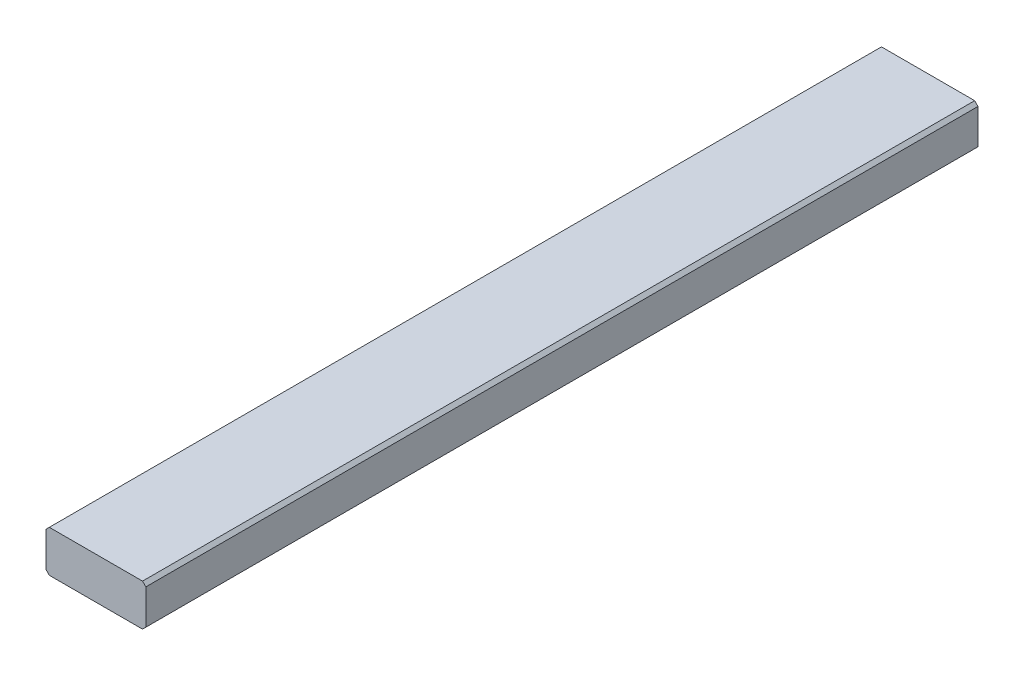
ISO-10303-21;
HEADER;
FILE_DESCRIPTION(('STEP AP214'),'2;1');
FILE_NAME('part.step','',(''),(''),'','','');
FILE_SCHEMA(('AUTOMOTIVE_DESIGN { 1 0 10303 214 1 1 1 1 }'));
ENDSEC;
DATA;
#1=APPLICATION_CONTEXT('core data for automotive mechanical design processes');
#2=APPLICATION_PROTOCOL_DEFINITION('international standard','automotive_design',2000,#1);
#3=PRODUCT_CONTEXT('',#1,'mechanical');
#4=PRODUCT('Part','Part','',(#3));
#5=PRODUCT_RELATED_PRODUCT_CATEGORY('part','',(#4));
#6=PRODUCT_DEFINITION_FORMATION('','',#4);
#7=PRODUCT_DEFINITION_CONTEXT('part definition',#1,'design');
#8=PRODUCT_DEFINITION('design','',#6,#7);
#9=PRODUCT_DEFINITION_SHAPE('','',#8);
#10=(LENGTH_UNIT() NAMED_UNIT(*) SI_UNIT(.MILLI.,.METRE.));
#11=(NAMED_UNIT(*) PLANE_ANGLE_UNIT() SI_UNIT($,.RADIAN.));
#12=(NAMED_UNIT(*) SI_UNIT($,.STERADIAN.) SOLID_ANGLE_UNIT());
#13=UNCERTAINTY_MEASURE_WITH_UNIT(LENGTH_MEASURE(1.E-05),#10,'distance_accuracy_value','');
#14=(GEOMETRIC_REPRESENTATION_CONTEXT(3) GLOBAL_UNCERTAINTY_ASSIGNED_CONTEXT((#13)) GLOBAL_UNIT_ASSIGNED_CONTEXT((#10,
#11,#12)) REPRESENTATION_CONTEXT('',''));
#15=CARTESIAN_POINT('',(0.,0.,0.));
#16=DIRECTION('',(0.,0.,1.));
#17=DIRECTION('',(1.,0.,0.));
#18=AXIS2_PLACEMENT_3D('',#15,#16,#17);
#19=CARTESIAN_POINT('',(-28.,12.5,500.));
#20=DIRECTION('',(0.,-1.,0.));
#21=DIRECTION('',(0.,0.,-1.));
#22=AXIS2_PLACEMENT_3D('',#19,#20,#21);
#23=PLANE('',#22);
#24=DIRECTION('',(-1.,0.,0.));
#25=VECTOR('',#24,1.);
#26=CARTESIAN_POINT('',(-28.,12.5,0.));
#27=LINE('',#26,#25);
#28=CARTESIAN_POINT('',(28.,12.5,0.));
#29=VERTEX_POINT('',#28);
#30=CARTESIAN_POINT('',(-28.,12.5,0.));
#31=VERTEX_POINT('',#30);
#32=EDGE_CURVE('E131',#29,#31,#27,.T.);
#33=ORIENTED_EDGE('',*,*,#32,.T.);
#34=DIRECTION('',(0.,0.,-1.));
#35=VECTOR('',#34,1.);
#36=CARTESIAN_POINT('',(-28.,12.5,500.));
#37=LINE('',#36,#35);
#38=CARTESIAN_POINT('',(-28.,12.5,500.));
#39=VERTEX_POINT('',#38);
#40=EDGE_CURVE('E11',#39,#31,#37,.T.);
#41=ORIENTED_EDGE('',*,*,#40,.F.);
#42=DIRECTION('',(-1.,0.,0.));
#43=VECTOR('',#42,1.);
#44=CARTESIAN_POINT('',(-28.,12.5,500.));
#45=LINE('',#44,#43);
#46=CARTESIAN_POINT('',(28.,12.5,500.));
#47=VERTEX_POINT('',#46);
#48=EDGE_CURVE('E145',#47,#39,#45,.T.);
#49=ORIENTED_EDGE('',*,*,#48,.F.);
#50=DIRECTION('',(0.,0.,-1.));
#51=VECTOR('',#50,1.);
#52=CARTESIAN_POINT('',(28.,12.5,500.));
#53=LINE('',#52,#51);
#54=EDGE_CURVE('E127',#47,#29,#53,.T.);
#55=ORIENTED_EDGE('',*,*,#54,.T.);
#56=EDGE_LOOP('',(#33,#41,#49,#55));
#57=FACE_BOUND('',#56,.T.);
#58=ADVANCED_FACE('F35',(#57),#23,.F.);
#59=CARTESIAN_POINT('',(-30.,10.5,500.));
#60=DIRECTION('',(0.707106781186547,-0.707106781186548,0.));
#61=DIRECTION('',(0.707106781186548,0.707106781186547,0.));
#62=AXIS2_PLACEMENT_3D('',#59,#60,#61);
#63=PLANE('',#62);
#64=DIRECTION('',(-0.707106781186548,-0.707106781186547,0.));
#65=VECTOR('',#64,1.);
#66=CARTESIAN_POINT('',(-30.,10.5,0.));
#67=LINE('',#66,#65);
#68=CARTESIAN_POINT('',(-30.,10.5,0.));
#69=VERTEX_POINT('',#68);
#70=EDGE_CURVE('E134',#31,#69,#67,.T.);
#71=ORIENTED_EDGE('',*,*,#70,.T.);
#72=DIRECTION('',(0.,0.,-1.));
#73=VECTOR('',#72,1.);
#74=CARTESIAN_POINT('',(-30.,10.5,500.));
#75=LINE('',#74,#73);
#76=CARTESIAN_POINT('',(-30.,10.5,500.));
#77=VERTEX_POINT('',#76);
#78=EDGE_CURVE('E43',#77,#69,#75,.T.);
#79=ORIENTED_EDGE('',*,*,#78,.F.);
#80=DIRECTION('',(-0.707106781186548,-0.707106781186547,0.));
#81=VECTOR('',#80,1.);
#82=CARTESIAN_POINT('',(-30.,10.5,500.));
#83=LINE('',#82,#81);
#84=EDGE_CURVE('E94',#39,#77,#83,.T.);
#85=ORIENTED_EDGE('',*,*,#84,.F.);
#86=ORIENTED_EDGE('',*,*,#40,.T.);
#87=EDGE_LOOP('',(#71,#79,#85,#86));
#88=FACE_BOUND('',#87,.T.);
#89=ADVANCED_FACE('F180',(#88),#63,.F.);
#90=CARTESIAN_POINT('',(-30.,10.5,500.));
#91=DIRECTION('',(1.,0.,0.));
#92=DIRECTION('',(0.,0.,-1.));
#93=AXIS2_PLACEMENT_3D('',#90,#91,#92);
#94=PLANE('',#93);
#95=DIRECTION('',(0.,-1.,0.));
#96=VECTOR('',#95,1.);
#97=CARTESIAN_POINT('',(-30.,10.5,0.));
#98=LINE('',#97,#96);
#99=CARTESIAN_POINT('',(-30.,-10.5,0.));
#100=VERTEX_POINT('',#99);
#101=EDGE_CURVE('E136',#69,#100,#98,.T.);
#102=ORIENTED_EDGE('',*,*,#101,.T.);
#103=DIRECTION('',(0.,0.,-1.));
#104=VECTOR('',#103,1.);
#105=CARTESIAN_POINT('',(-30.,-10.5,500.));
#106=LINE('',#105,#104);
#107=CARTESIAN_POINT('',(-30.,-10.5,500.));
#108=VERTEX_POINT('',#107);
#109=EDGE_CURVE('E152',#108,#100,#106,.T.);
#110=ORIENTED_EDGE('',*,*,#109,.F.);
#111=DIRECTION('',(0.,-1.,0.));
#112=VECTOR('',#111,1.);
#113=CARTESIAN_POINT('',(-30.,10.5,500.));
#114=LINE('',#113,#112);
#115=EDGE_CURVE('E160',#77,#108,#114,.T.);
#116=ORIENTED_EDGE('',*,*,#115,.F.);
#117=ORIENTED_EDGE('',*,*,#78,.T.);
#118=EDGE_LOOP('',(#102,#110,#116,#117));
#119=FACE_BOUND('',#118,.T.);
#120=ADVANCED_FACE('F158',(#119),#94,.F.);
#121=CARTESIAN_POINT('',(-30.,-10.5,500.));
#122=DIRECTION('',(0.707106781186547,0.707106781186548,0.));
#123=DIRECTION('',(-0.707106781186548,0.707106781186547,0.));
#124=AXIS2_PLACEMENT_3D('',#121,#122,#123);
#125=PLANE('',#124);
#126=DIRECTION('',(0.707106781186548,-0.707106781186547,0.));
#127=VECTOR('',#126,1.);
#128=CARTESIAN_POINT('',(-30.,-10.5,0.));
#129=LINE('',#128,#127);
#130=CARTESIAN_POINT('',(-28.,-12.5,0.));
#131=VERTEX_POINT('',#130);
#132=EDGE_CURVE('E138',#100,#131,#129,.T.);
#133=ORIENTED_EDGE('',*,*,#132,.T.);
#134=DIRECTION('',(0.,0.,-1.));
#135=VECTOR('',#134,1.);
#136=CARTESIAN_POINT('',(-28.,-12.5,500.));
#137=LINE('',#136,#135);
#138=CARTESIAN_POINT('',(-28.,-12.5,500.));
#139=VERTEX_POINT('',#138);
#140=EDGE_CURVE('E149',#139,#131,#137,.T.);
#141=ORIENTED_EDGE('',*,*,#140,.F.);
#142=DIRECTION('',(0.707106781186548,-0.707106781186547,0.));
#143=VECTOR('',#142,1.);
#144=CARTESIAN_POINT('',(-30.,-10.5,500.));
#145=LINE('',#144,#143);
#146=EDGE_CURVE('E172',#108,#139,#145,.T.);
#147=ORIENTED_EDGE('',*,*,#146,.F.);
#148=ORIENTED_EDGE('',*,*,#109,.T.);
#149=EDGE_LOOP('',(#133,#141,#147,#148));
#150=FACE_BOUND('',#149,.T.);
#151=ADVANCED_FACE('F168',(#150),#125,.F.);
#152=CARTESIAN_POINT('',(-28.,-12.5,500.));
#153=DIRECTION('',(0.,1.,0.));
#154=DIRECTION('',(0.,0.,1.));
#155=AXIS2_PLACEMENT_3D('',#152,#153,#154);
#156=PLANE('',#155);
#157=DIRECTION('',(1.,0.,0.));
#158=VECTOR('',#157,1.);
#159=CARTESIAN_POINT('',(-28.,-12.5,0.));
#160=LINE('',#159,#158);
#161=CARTESIAN_POINT('',(28.,-12.5,0.));
#162=VERTEX_POINT('',#161);
#163=EDGE_CURVE('E140',#131,#162,#160,.T.);
#164=ORIENTED_EDGE('',*,*,#163,.T.);
#165=DIRECTION('',(0.,0.,-1.));
#166=VECTOR('',#165,1.);
#167=CARTESIAN_POINT('',(28.,-12.5,500.));
#168=LINE('',#167,#166);
#169=CARTESIAN_POINT('',(28.,-12.5,500.));
#170=VERTEX_POINT('',#169);
#171=EDGE_CURVE('E122',#170,#162,#168,.T.);
#172=ORIENTED_EDGE('',*,*,#171,.F.);
#173=DIRECTION('',(1.,0.,0.));
#174=VECTOR('',#173,1.);
#175=CARTESIAN_POINT('',(-28.,-12.5,500.));
#176=LINE('',#175,#174);
#177=EDGE_CURVE('E113',#139,#170,#176,.T.);
#178=ORIENTED_EDGE('',*,*,#177,.F.);
#179=ORIENTED_EDGE('',*,*,#140,.T.);
#180=EDGE_LOOP('',(#164,#172,#178,#179));
#181=FACE_BOUND('',#180,.T.);
#182=ADVANCED_FACE('F171',(#181),#156,.F.);
#183=CARTESIAN_POINT('',(28.,-12.5,500.));
#184=DIRECTION('',(-0.707106781186547,0.707106781186548,0.));
#185=DIRECTION('',(-0.707106781186548,-0.707106781186547,0.));
#186=AXIS2_PLACEMENT_3D('',#183,#184,#185);
#187=PLANE('',#186);
#188=DIRECTION('',(0.707106781186548,0.707106781186547,0.));
#189=VECTOR('',#188,1.);
#190=CARTESIAN_POINT('',(28.,-12.5,0.));
#191=LINE('',#190,#189);
#192=CARTESIAN_POINT('',(30.,-10.5,0.));
#193=VERTEX_POINT('',#192);
#194=EDGE_CURVE('E121',#162,#193,#191,.T.);
#195=ORIENTED_EDGE('',*,*,#194,.T.);
#196=DIRECTION('',(0.,0.,-1.));
#197=VECTOR('',#196,1.);
#198=CARTESIAN_POINT('',(30.,-10.5,500.));
#199=LINE('',#198,#197);
#200=CARTESIAN_POINT('',(30.,-10.5,500.));
#201=VERTEX_POINT('',#200);
#202=EDGE_CURVE('E118',#201,#193,#199,.T.);
#203=ORIENTED_EDGE('',*,*,#202,.F.);
#204=DIRECTION('',(0.707106781186548,0.707106781186547,0.));
#205=VECTOR('',#204,1.);
#206=CARTESIAN_POINT('',(28.,-12.5,500.));
#207=LINE('',#206,#205);
#208=EDGE_CURVE('E107',#170,#201,#207,.T.);
#209=ORIENTED_EDGE('',*,*,#208,.F.);
#210=ORIENTED_EDGE('',*,*,#171,.T.);
#211=EDGE_LOOP('',(#195,#203,#209,#210));
#212=FACE_BOUND('',#211,.T.);
#213=ADVANCED_FACE('F119',(#212),#187,.F.);
#214=CARTESIAN_POINT('',(30.,10.5,500.));
#215=DIRECTION('',(-1.,0.,0.));
#216=DIRECTION('',(0.,0.,1.));
#217=AXIS2_PLACEMENT_3D('',#214,#215,#216);
#218=PLANE('',#217);
#219=DIRECTION('',(0.,1.,0.));
#220=VECTOR('',#219,1.);
#221=CARTESIAN_POINT('',(30.,10.5,0.));
#222=LINE('',#221,#220);
#223=CARTESIAN_POINT('',(30.,10.5,0.));
#224=VERTEX_POINT('',#223);
#225=EDGE_CURVE('E80',#193,#224,#222,.T.);
#226=ORIENTED_EDGE('',*,*,#225,.T.);
#227=DIRECTION('',(0.,0.,-1.));
#228=VECTOR('',#227,1.);
#229=CARTESIAN_POINT('',(30.,10.5,500.));
#230=LINE('',#229,#228);
#231=CARTESIAN_POINT('',(30.,10.5,500.));
#232=VERTEX_POINT('',#231);
#233=EDGE_CURVE('E123',#232,#224,#230,.T.);
#234=ORIENTED_EDGE('',*,*,#233,.F.);
#235=DIRECTION('',(0.,1.,0.));
#236=VECTOR('',#235,1.);
#237=CARTESIAN_POINT('',(30.,10.5,500.));
#238=LINE('',#237,#236);
#239=EDGE_CURVE('E111',#201,#232,#238,.T.);
#240=ORIENTED_EDGE('',*,*,#239,.F.);
#241=ORIENTED_EDGE('',*,*,#202,.T.);
#242=EDGE_LOOP('',(#226,#234,#240,#241));
#243=FACE_BOUND('',#242,.T.);
#244=ADVANCED_FACE('F125',(#243),#218,.F.);
#245=CARTESIAN_POINT('',(28.,12.5,500.));
#246=DIRECTION('',(-0.707106781186547,-0.707106781186548,0.));
#247=DIRECTION('',(0.707106781186548,-0.707106781186547,0.));
#248=AXIS2_PLACEMENT_3D('',#245,#246,#247);
#249=PLANE('',#248);
#250=DIRECTION('',(-0.707106781186548,0.707106781186547,0.));
#251=VECTOR('',#250,1.);
#252=CARTESIAN_POINT('',(28.,12.5,0.));
#253=LINE('',#252,#251);
#254=EDGE_CURVE('E86',#224,#29,#253,.T.);
#255=ORIENTED_EDGE('',*,*,#254,.T.);
#256=ORIENTED_EDGE('',*,*,#54,.F.);
#257=DIRECTION('',(-0.707106781186548,0.707106781186547,0.));
#258=VECTOR('',#257,1.);
#259=CARTESIAN_POINT('',(28.,12.5,500.));
#260=LINE('',#259,#258);
#261=EDGE_CURVE('E51',#232,#47,#260,.T.);
#262=ORIENTED_EDGE('',*,*,#261,.F.);
#263=ORIENTED_EDGE('',*,*,#233,.T.);
#264=EDGE_LOOP('',(#255,#256,#262,#263));
#265=FACE_BOUND('',#264,.T.);
#266=ADVANCED_FACE('F196',(#265),#249,.F.);
#267=CARTESIAN_POINT('',(0.,0.,500.));
#268=DIRECTION('',(0.,0.,-1.));
#269=DIRECTION('',(-1.,0.,0.));
#270=AXIS2_PLACEMENT_3D('',#267,#268,#269);
#271=PLANE('',#270);
#272=ORIENTED_EDGE('',*,*,#48,.T.);
#273=ORIENTED_EDGE('',*,*,#84,.T.);
#274=ORIENTED_EDGE('',*,*,#115,.T.);
#275=ORIENTED_EDGE('',*,*,#146,.T.);
#276=ORIENTED_EDGE('',*,*,#177,.T.);
#277=ORIENTED_EDGE('',*,*,#208,.T.);
#278=ORIENTED_EDGE('',*,*,#239,.T.);
#279=ORIENTED_EDGE('',*,*,#261,.T.);
#280=EDGE_LOOP('',(#272,#273,#274,#275,#276,#277,#278,#279));
#281=FACE_BOUND('',#280,.T.);
#282=ADVANCED_FACE('F109',(#281),#271,.F.);
#283=CARTESIAN_POINT('',(0.,0.,0.));
#284=DIRECTION('',(0.,0.,-1.));
#285=DIRECTION('',(-1.,0.,0.));
#286=AXIS2_PLACEMENT_3D('',#283,#284,#285);
#287=PLANE('',#286);
#288=ORIENTED_EDGE('',*,*,#32,.F.);
#289=ORIENTED_EDGE('',*,*,#254,.F.);
#290=ORIENTED_EDGE('',*,*,#225,.F.);
#291=ORIENTED_EDGE('',*,*,#194,.F.);
#292=ORIENTED_EDGE('',*,*,#163,.F.);
#293=ORIENTED_EDGE('',*,*,#132,.F.);
#294=ORIENTED_EDGE('',*,*,#101,.F.);
#295=ORIENTED_EDGE('',*,*,#70,.F.);
#296=EDGE_LOOP('',(#288,#289,#290,#291,#292,#293,#294,#295));
#297=FACE_BOUND('',#296,.T.);
#298=ADVANCED_FACE('F164',(#297),#287,.T.);
#299=CLOSED_SHELL('',(#58,#89,#120,#151,#182,#213,#244,#266,#282,#298));
#300=MANIFOLD_SOLID_BREP('B2',#299);
#301=ADVANCED_BREP_SHAPE_REPRESENTATION('',(#18,#300),#14);
#302=SHAPE_DEFINITION_REPRESENTATION(#9,#301);
ENDSEC;
END-ISO-10303-21;
